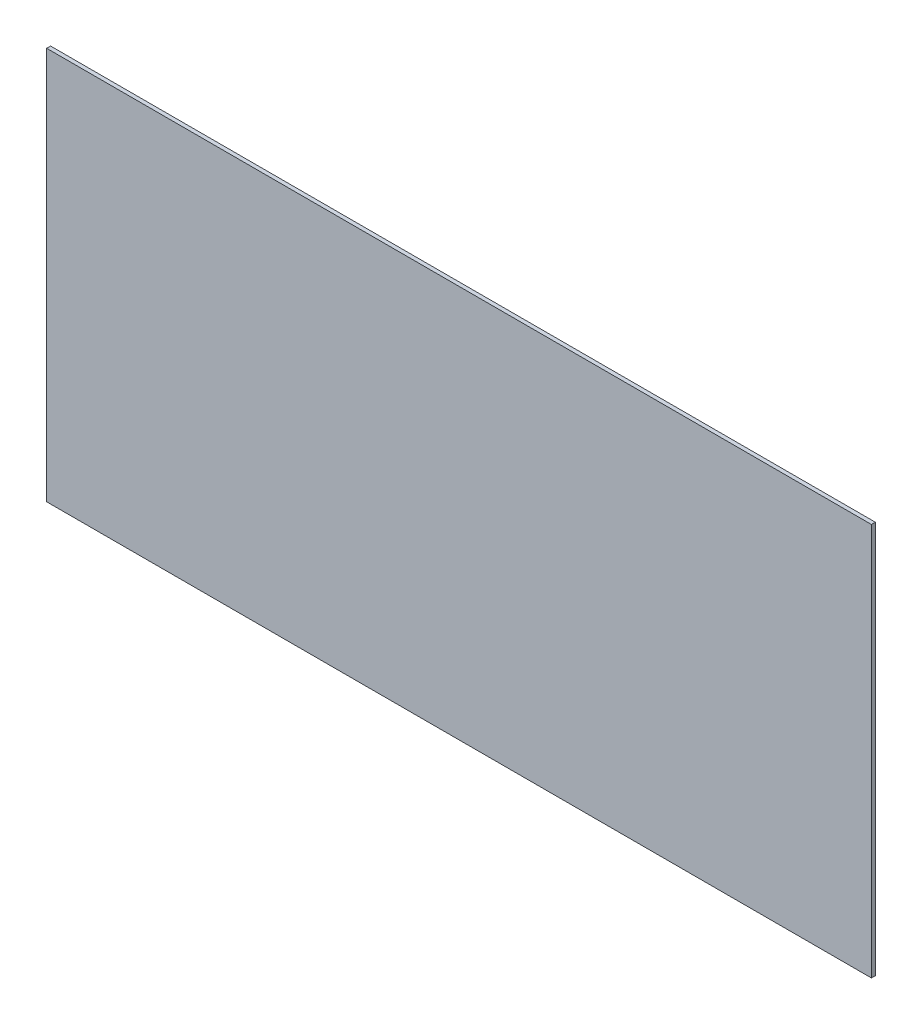
ISO-10303-21;
HEADER;
FILE_DESCRIPTION(('STEP AP214'),'2;1');
FILE_NAME('part.step','',(''),(''),'','','');
FILE_SCHEMA(('AUTOMOTIVE_DESIGN { 1 0 10303 214 1 1 1 1 }'));
ENDSEC;
DATA;
#1=APPLICATION_CONTEXT('core data for automotive mechanical design processes');
#2=APPLICATION_PROTOCOL_DEFINITION('international standard','automotive_design',2000,#1);
#3=PRODUCT_CONTEXT('',#1,'mechanical');
#4=PRODUCT('Part','Part','',(#3));
#5=PRODUCT_RELATED_PRODUCT_CATEGORY('part','',(#4));
#6=PRODUCT_DEFINITION_FORMATION('','',#4);
#7=PRODUCT_DEFINITION_CONTEXT('part definition',#1,'design');
#8=PRODUCT_DEFINITION('design','',#6,#7);
#9=PRODUCT_DEFINITION_SHAPE('','',#8);
#10=(LENGTH_UNIT() NAMED_UNIT(*) SI_UNIT(.MILLI.,.METRE.));
#11=(NAMED_UNIT(*) PLANE_ANGLE_UNIT() SI_UNIT($,.RADIAN.));
#12=(NAMED_UNIT(*) SI_UNIT($,.STERADIAN.) SOLID_ANGLE_UNIT());
#13=UNCERTAINTY_MEASURE_WITH_UNIT(LENGTH_MEASURE(1.E-05),#10,'distance_accuracy_value','');
#14=(GEOMETRIC_REPRESENTATION_CONTEXT(3) GLOBAL_UNCERTAINTY_ASSIGNED_CONTEXT((#13)) GLOBAL_UNIT_ASSIGNED_CONTEXT((#10,
#11,#12)) REPRESENTATION_CONTEXT('',''));
#15=CARTESIAN_POINT('',(0.,0.,0.));
#16=DIRECTION('',(0.,0.,1.));
#17=DIRECTION('',(1.,0.,0.));
#18=AXIS2_PLACEMENT_3D('',#15,#16,#17);
#19=CARTESIAN_POINT('',(0.,0.,10.));
#20=DIRECTION('',(1.,0.,0.));
#21=DIRECTION('',(0.,0.,-1.));
#22=AXIS2_PLACEMENT_3D('',#19,#20,#21);
#23=PLANE('',#22);
#24=DIRECTION('',(0.,-1.,0.));
#25=VECTOR('',#24,1.);
#26=CARTESIAN_POINT('',(0.,0.,0.));
#27=LINE('',#26,#25);
#28=CARTESIAN_POINT('',(0.,1000.,0.));
#29=VERTEX_POINT('',#28);
#30=CARTESIAN_POINT('',(0.,0.,0.));
#31=VERTEX_POINT('',#30);
#32=EDGE_CURVE('E97',#29,#31,#27,.T.);
#33=ORIENTED_EDGE('',*,*,#32,.T.);
#34=DIRECTION('',(0.,0.,-1.));
#35=VECTOR('',#34,1.);
#36=CARTESIAN_POINT('',(0.,0.,10.));
#37=LINE('',#36,#35);
#38=CARTESIAN_POINT('',(0.,0.,10.));
#39=VERTEX_POINT('',#38);
#40=EDGE_CURVE('E11',#39,#31,#37,.T.);
#41=ORIENTED_EDGE('',*,*,#40,.F.);
#42=DIRECTION('',(0.,-1.,0.));
#43=VECTOR('',#42,1.);
#44=CARTESIAN_POINT('',(0.,0.,10.));
#45=LINE('',#44,#43);
#46=CARTESIAN_POINT('',(0.,1000.,10.));
#47=VERTEX_POINT('',#46);
#48=EDGE_CURVE('E85',#47,#39,#45,.T.);
#49=ORIENTED_EDGE('',*,*,#48,.F.);
#50=DIRECTION('',(0.,0.,-1.));
#51=VECTOR('',#50,1.);
#52=CARTESIAN_POINT('',(0.,1000.,10.));
#53=LINE('',#52,#51);
#54=EDGE_CURVE('E93',#47,#29,#53,.T.);
#55=ORIENTED_EDGE('',*,*,#54,.T.);
#56=EDGE_LOOP('',(#33,#41,#49,#55));
#57=FACE_BOUND('',#56,.T.);
#58=ADVANCED_FACE('F34',(#57),#23,.F.);
#59=CARTESIAN_POINT('',(0.,0.,10.));
#60=DIRECTION('',(0.,1.,0.));
#61=DIRECTION('',(0.,0.,1.));
#62=AXIS2_PLACEMENT_3D('',#59,#60,#61);
#63=PLANE('',#62);
#64=DIRECTION('',(1.,0.,0.));
#65=VECTOR('',#64,1.);
#66=CARTESIAN_POINT('',(0.,0.,0.));
#67=LINE('',#66,#65);
#68=CARTESIAN_POINT('',(2100.,0.,0.));
#69=VERTEX_POINT('',#68);
#70=EDGE_CURVE('E89',#31,#69,#67,.T.);
#71=ORIENTED_EDGE('',*,*,#70,.T.);
#72=DIRECTION('',(0.,0.,-1.));
#73=VECTOR('',#72,1.);
#74=CARTESIAN_POINT('',(2100.,0.,10.));
#75=LINE('',#74,#73);
#76=CARTESIAN_POINT('',(2100.,0.,10.));
#77=VERTEX_POINT('',#76);
#78=EDGE_CURVE('E42',#77,#69,#75,.T.);
#79=ORIENTED_EDGE('',*,*,#78,.F.);
#80=DIRECTION('',(1.,0.,0.));
#81=VECTOR('',#80,1.);
#82=CARTESIAN_POINT('',(0.,0.,10.));
#83=LINE('',#82,#81);
#84=EDGE_CURVE('E80',#39,#77,#83,.T.);
#85=ORIENTED_EDGE('',*,*,#84,.F.);
#86=ORIENTED_EDGE('',*,*,#40,.T.);
#87=EDGE_LOOP('',(#71,#79,#85,#86));
#88=FACE_BOUND('',#87,.T.);
#89=ADVANCED_FACE('F88',(#88),#63,.F.);
#90=CARTESIAN_POINT('',(2100.,0.,10.));
#91=DIRECTION('',(-1.,0.,0.));
#92=DIRECTION('',(0.,0.,1.));
#93=AXIS2_PLACEMENT_3D('',#90,#91,#92);
#94=PLANE('',#93);
#95=DIRECTION('',(0.,1.,0.));
#96=VECTOR('',#95,1.);
#97=CARTESIAN_POINT('',(2100.,0.,0.));
#98=LINE('',#97,#96);
#99=CARTESIAN_POINT('',(2100.,1000.,0.));
#100=VERTEX_POINT('',#99);
#101=EDGE_CURVE('E67',#69,#100,#98,.T.);
#102=ORIENTED_EDGE('',*,*,#101,.T.);
#103=DIRECTION('',(0.,0.,-1.));
#104=VECTOR('',#103,1.);
#105=CARTESIAN_POINT('',(2100.,1000.,10.));
#106=LINE('',#105,#104);
#107=CARTESIAN_POINT('',(2100.,1000.,10.));
#108=VERTEX_POINT('',#107);
#109=EDGE_CURVE('E90',#108,#100,#106,.T.);
#110=ORIENTED_EDGE('',*,*,#109,.F.);
#111=DIRECTION('',(0.,1.,0.));
#112=VECTOR('',#111,1.);
#113=CARTESIAN_POINT('',(2100.,0.,10.));
#114=LINE('',#113,#112);
#115=EDGE_CURVE('E83',#77,#108,#114,.T.);
#116=ORIENTED_EDGE('',*,*,#115,.F.);
#117=ORIENTED_EDGE('',*,*,#78,.T.);
#118=EDGE_LOOP('',(#102,#110,#116,#117));
#119=FACE_BOUND('',#118,.T.);
#120=ADVANCED_FACE('F91',(#119),#94,.F.);
#121=CARTESIAN_POINT('',(0.,1000.,10.));
#122=DIRECTION('',(0.,-1.,0.));
#123=DIRECTION('',(0.,0.,-1.));
#124=AXIS2_PLACEMENT_3D('',#121,#122,#123);
#125=PLANE('',#124);
#126=DIRECTION('',(-1.,0.,0.));
#127=VECTOR('',#126,1.);
#128=CARTESIAN_POINT('',(0.,1000.,0.));
#129=LINE('',#128,#127);
#130=EDGE_CURVE('E73',#100,#29,#129,.T.);
#131=ORIENTED_EDGE('',*,*,#130,.T.);
#132=ORIENTED_EDGE('',*,*,#54,.F.);
#133=DIRECTION('',(-1.,0.,0.));
#134=VECTOR('',#133,1.);
#135=CARTESIAN_POINT('',(0.,1000.,10.));
#136=LINE('',#135,#134);
#137=EDGE_CURVE('E50',#108,#47,#136,.T.);
#138=ORIENTED_EDGE('',*,*,#137,.F.);
#139=ORIENTED_EDGE('',*,*,#109,.T.);
#140=EDGE_LOOP('',(#131,#132,#138,#139));
#141=FACE_BOUND('',#140,.T.);
#142=ADVANCED_FACE('F104',(#141),#125,.F.);
#143=CARTESIAN_POINT('',(0.,0.,10.));
#144=DIRECTION('',(0.,0.,-1.));
#145=DIRECTION('',(-1.,0.,0.));
#146=AXIS2_PLACEMENT_3D('',#143,#144,#145);
#147=PLANE('',#146);
#148=ORIENTED_EDGE('',*,*,#48,.T.);
#149=ORIENTED_EDGE('',*,*,#84,.T.);
#150=ORIENTED_EDGE('',*,*,#115,.T.);
#151=ORIENTED_EDGE('',*,*,#137,.T.);
#152=EDGE_LOOP('',(#148,#149,#150,#151));
#153=FACE_BOUND('',#152,.T.);
#154=ADVANCED_FACE('F81',(#153),#147,.F.);
#155=CARTESIAN_POINT('',(0.,0.,0.));
#156=DIRECTION('',(0.,0.,-1.));
#157=DIRECTION('',(-1.,0.,0.));
#158=AXIS2_PLACEMENT_3D('',#155,#156,#157);
#159=PLANE('',#158);
#160=ORIENTED_EDGE('',*,*,#32,.F.);
#161=ORIENTED_EDGE('',*,*,#130,.F.);
#162=ORIENTED_EDGE('',*,*,#101,.F.);
#163=ORIENTED_EDGE('',*,*,#70,.F.);
#164=EDGE_LOOP('',(#160,#161,#162,#163));
#165=FACE_BOUND('',#164,.T.);
#166=ADVANCED_FACE('F107',(#165),#159,.T.);
#167=CLOSED_SHELL('',(#58,#89,#120,#142,#154,#166));
#168=MANIFOLD_SOLID_BREP('B2',#167);
#169=ADVANCED_BREP_SHAPE_REPRESENTATION('',(#18,#168),#14);
#170=SHAPE_DEFINITION_REPRESENTATION(#9,#169);
ENDSEC;
END-ISO-10303-21;
